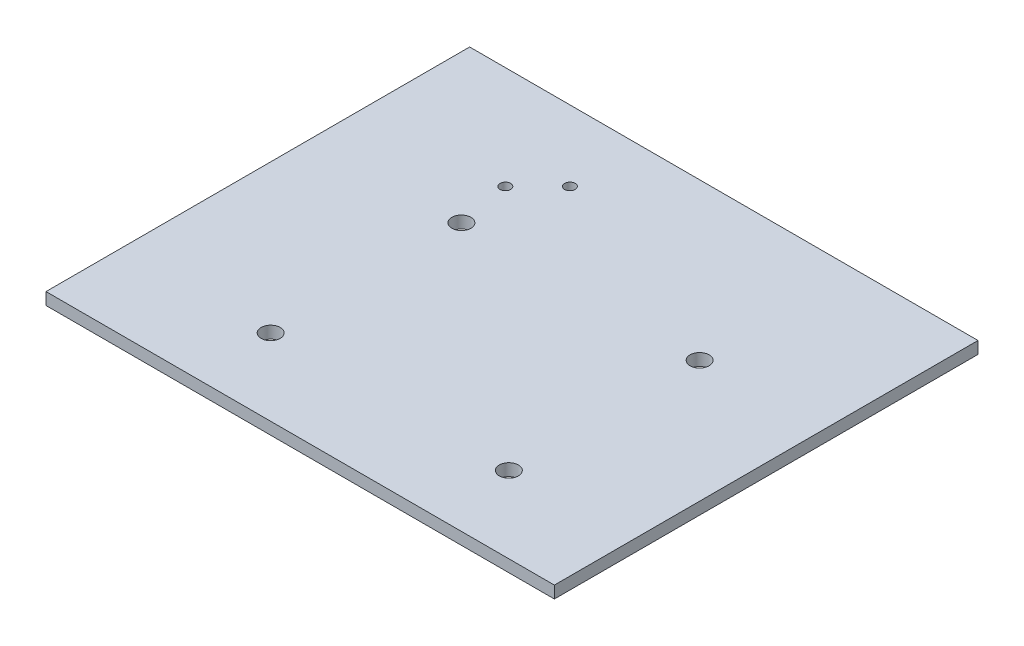
ISO-10303-21;
HEADER;
FILE_DESCRIPTION(('STEP AP214'),'2;1');
FILE_NAME('part.step','',(''),(''),'','','');
FILE_SCHEMA(('AUTOMOTIVE_DESIGN { 1 0 10303 214 1 1 1 1 }'));
ENDSEC;
DATA;
#1=APPLICATION_CONTEXT('core data for automotive mechanical design processes');
#2=APPLICATION_PROTOCOL_DEFINITION('international standard','automotive_design',2000,#1);
#3=PRODUCT_CONTEXT('',#1,'mechanical');
#4=PRODUCT('Part','Part','',(#3));
#5=PRODUCT_RELATED_PRODUCT_CATEGORY('part','',(#4));
#6=PRODUCT_DEFINITION_FORMATION('','',#4);
#7=PRODUCT_DEFINITION_CONTEXT('part definition',#1,'design');
#8=PRODUCT_DEFINITION('design','',#6,#7);
#9=PRODUCT_DEFINITION_SHAPE('','',#8);
#10=(LENGTH_UNIT() NAMED_UNIT(*) SI_UNIT(.MILLI.,.METRE.));
#11=(NAMED_UNIT(*) PLANE_ANGLE_UNIT() SI_UNIT($,.RADIAN.));
#12=(NAMED_UNIT(*) SI_UNIT($,.STERADIAN.) SOLID_ANGLE_UNIT());
#13=UNCERTAINTY_MEASURE_WITH_UNIT(LENGTH_MEASURE(1.E-05),#10,'distance_accuracy_value','');
#14=(GEOMETRIC_REPRESENTATION_CONTEXT(3) GLOBAL_UNCERTAINTY_ASSIGNED_CONTEXT((#13)) GLOBAL_UNIT_ASSIGNED_CONTEXT((#10,
#11,#12)) REPRESENTATION_CONTEXT('',''));
#15=CARTESIAN_POINT('',(0.,0.,0.));
#16=DIRECTION('',(0.,0.,1.));
#17=DIRECTION('',(1.,0.,0.));
#18=AXIS2_PLACEMENT_3D('',#15,#16,#17);
#19=CARTESIAN_POINT('',(-292.1,-0.00999999999999959,-222.25));
#20=DIRECTION('',(-1.,0.,0.));
#21=DIRECTION('',(0.,0.,1.));
#22=AXIS2_PLACEMENT_3D('',#19,#20,#21);
#23=PLANE('',#22);
#24=DIRECTION('',(0.,-1.,0.));
#25=VECTOR('',#24,1.);
#26=CARTESIAN_POINT('',(-292.1,6.35,-222.25));
#27=LINE('',#26,#25);
#28=CARTESIAN_POINT('',(-292.1,6.35,-222.25));
#29=VERTEX_POINT('',#28);
#30=CARTESIAN_POINT('',(-292.1,0.,-222.25));
#31=VERTEX_POINT('',#30);
#32=EDGE_CURVE('E128',#29,#31,#27,.T.);
#33=ORIENTED_EDGE('',*,*,#32,.F.);
#34=DIRECTION('',(0.,0.,1.));
#35=VECTOR('',#34,1.);
#36=CARTESIAN_POINT('',(-292.1,6.35,0.));
#37=LINE('',#36,#35);
#38=CARTESIAN_POINT('',(-292.1,6.35,0.));
#39=VERTEX_POINT('',#38);
#40=EDGE_CURVE('E11',#29,#39,#37,.T.);
#41=ORIENTED_EDGE('',*,*,#40,.T.);
#42=DIRECTION('',(0.,1.,0.));
#43=VECTOR('',#42,1.);
#44=CARTESIAN_POINT('',(-292.1,6.35,0.));
#45=LINE('',#44,#43);
#46=CARTESIAN_POINT('',(-292.1,0.,0.));
#47=VERTEX_POINT('',#46);
#48=EDGE_CURVE('E45',#47,#39,#45,.T.);
#49=ORIENTED_EDGE('',*,*,#48,.F.);
#50=DIRECTION('',(0.,0.,1.));
#51=VECTOR('',#50,1.);
#52=CARTESIAN_POINT('',(-292.1,0.,0.));
#53=LINE('',#52,#51);
#54=EDGE_CURVE('E107',#31,#47,#53,.T.);
#55=ORIENTED_EDGE('',*,*,#54,.F.);
#56=EDGE_LOOP('',(#33,#41,#49,#55));
#57=FACE_BOUND('',#56,.T.);
#58=ADVANCED_FACE('F42',(#57),#23,.F.);
#59=CARTESIAN_POINT('',(-558.8,6.35,-222.25));
#60=DIRECTION('',(1.,0.,0.));
#61=DIRECTION('',(0.,0.,-1.));
#62=AXIS2_PLACEMENT_3D('',#59,#60,#61);
#63=PLANE('',#62);
#64=DIRECTION('',(0.,0.,1.));
#65=VECTOR('',#64,1.);
#66=CARTESIAN_POINT('',(-558.8,0.,-222.25));
#67=LINE('',#66,#65);
#68=CARTESIAN_POINT('',(-558.8,0.,-222.25));
#69=VERTEX_POINT('',#68);
#70=CARTESIAN_POINT('',(-558.8,0.,0.));
#71=VERTEX_POINT('',#70);
#72=EDGE_CURVE('E125',#69,#71,#67,.T.);
#73=ORIENTED_EDGE('',*,*,#72,.T.);
#74=DIRECTION('',(0.,-1.,0.));
#75=VECTOR('',#74,1.);
#76=CARTESIAN_POINT('',(-558.8,6.35,0.));
#77=LINE('',#76,#75);
#78=CARTESIAN_POINT('',(-558.8,6.35,0.));
#79=VERTEX_POINT('',#78);
#80=EDGE_CURVE('E108',#79,#71,#77,.T.);
#81=ORIENTED_EDGE('',*,*,#80,.F.);
#82=DIRECTION('',(0.,0.,1.));
#83=VECTOR('',#82,1.);
#84=CARTESIAN_POINT('',(-558.8,6.35,-222.25));
#85=LINE('',#84,#83);
#86=CARTESIAN_POINT('',(-558.8,6.35,-222.25));
#87=VERTEX_POINT('',#86);
#88=EDGE_CURVE('E92',#87,#79,#85,.T.);
#89=ORIENTED_EDGE('',*,*,#88,.F.);
#90=DIRECTION('',(0.,-1.,0.));
#91=VECTOR('',#90,1.);
#92=CARTESIAN_POINT('',(-558.8,6.35,-222.25));
#93=LINE('',#92,#91);
#94=EDGE_CURVE('E100',#87,#69,#93,.T.);
#95=ORIENTED_EDGE('',*,*,#94,.T.);
#96=EDGE_LOOP('',(#73,#81,#89,#95));
#97=FACE_BOUND('',#96,.T.);
#98=ADVANCED_FACE('F110',(#97),#63,.F.);
#99=CARTESIAN_POINT('',(-558.8,6.35,0.));
#100=DIRECTION('',(0.,0.,-1.));
#101=DIRECTION('',(-1.,0.,0.));
#102=AXIS2_PLACEMENT_3D('',#99,#100,#101);
#103=PLANE('',#102);
#104=DIRECTION('',(1.,0.,0.));
#105=VECTOR('',#104,1.);
#106=CARTESIAN_POINT('',(-558.8,0.,0.));
#107=LINE('',#106,#105);
#108=EDGE_CURVE('E119',#71,#47,#107,.T.);
#109=ORIENTED_EDGE('',*,*,#108,.T.);
#110=ORIENTED_EDGE('',*,*,#48,.T.);
#111=DIRECTION('',(1.,0.,0.));
#112=VECTOR('',#111,1.);
#113=CARTESIAN_POINT('',(-558.8,6.35,0.));
#114=LINE('',#113,#112);
#115=EDGE_CURVE('E97',#79,#39,#114,.T.);
#116=ORIENTED_EDGE('',*,*,#115,.F.);
#117=ORIENTED_EDGE('',*,*,#80,.T.);
#118=EDGE_LOOP('',(#109,#110,#116,#117));
#119=FACE_BOUND('',#118,.T.);
#120=ADVANCED_FACE('F180',(#119),#103,.F.);
#121=CARTESIAN_POINT('',(-114.3,6.35,-222.25));
#122=DIRECTION('',(0.,0.,1.));
#123=DIRECTION('',(1.,0.,0.));
#124=AXIS2_PLACEMENT_3D('',#121,#122,#123);
#125=PLANE('',#124);
#126=DIRECTION('',(-1.,0.,0.));
#127=VECTOR('',#126,1.);
#128=CARTESIAN_POINT('',(-114.3,6.35,-222.25));
#129=LINE('',#128,#127);
#130=EDGE_CURVE('E87',#29,#87,#129,.T.);
#131=ORIENTED_EDGE('',*,*,#130,.F.);
#132=ORIENTED_EDGE('',*,*,#32,.T.);
#133=DIRECTION('',(-1.,0.,0.));
#134=VECTOR('',#133,1.);
#135=CARTESIAN_POINT('',(-114.3,0.,-222.25));
#136=LINE('',#135,#134);
#137=EDGE_CURVE('E103',#31,#69,#136,.T.);
#138=ORIENTED_EDGE('',*,*,#137,.T.);
#139=ORIENTED_EDGE('',*,*,#94,.F.);
#140=EDGE_LOOP('',(#131,#132,#138,#139));
#141=FACE_BOUND('',#140,.T.);
#142=ADVANCED_FACE('F101',(#141),#125,.F.);
#143=CARTESIAN_POINT('',(-481.076,0.,-40.132));
#144=DIRECTION('',(0.,1.,0.));
#145=DIRECTION('',(0.,0.,1.));
#146=AXIS2_PLACEMENT_3D('',#143,#144,#145);
#147=CYLINDRICAL_SURFACE('',#146,5.00000270000002);
#148=CARTESIAN_POINT('',(-481.076,6.35,-40.132));
#149=DIRECTION('',(0.,1.,0.));
#150=DIRECTION('',(0.,0.,1.));
#151=AXIS2_PLACEMENT_3D('',#148,#149,#150);
#152=CIRCLE('',#151,5.00000270000002);
#153=CARTESIAN_POINT('',(-481.076,6.35,-35.1319973));
#154=VERTEX_POINT('',#153);
#155=EDGE_CURVE('E138',#154,#154,#152,.T.);
#156=ORIENTED_EDGE('',*,*,#155,.T.);
#157=EDGE_LOOP('',(#156));
#158=FACE_BOUND('',#157,.T.);
#159=CARTESIAN_POINT('',(-481.076,0.,-40.132));
#160=DIRECTION('',(0.,1.,0.));
#161=DIRECTION('',(0.,0.,1.));
#162=AXIS2_PLACEMENT_3D('',#159,#160,#161);
#163=CIRCLE('',#162,5.00000270000002);
#164=CARTESIAN_POINT('',(-481.076,0.,-35.1319973));
#165=VERTEX_POINT('',#164);
#166=EDGE_CURVE('E135',#165,#165,#163,.T.);
#167=ORIENTED_EDGE('',*,*,#166,.F.);
#168=EDGE_LOOP('',(#167));
#169=FACE_BOUND('',#168,.T.);
#170=ADVANCED_FACE('F199',(#158,#169),#147,.F.);
#171=CARTESIAN_POINT('',(-356.108,0.,-40.132));
#172=DIRECTION('',(0.,1.,0.));
#173=DIRECTION('',(0.,0.,1.));
#174=AXIS2_PLACEMENT_3D('',#171,#172,#173);
#175=CYLINDRICAL_SURFACE('',#174,5.00000270000002);
#176=CARTESIAN_POINT('',(-356.108,6.35,-40.132));
#177=DIRECTION('',(0.,1.,0.));
#178=DIRECTION('',(0.,0.,1.));
#179=AXIS2_PLACEMENT_3D('',#176,#177,#178);
#180=CIRCLE('',#179,5.00000270000002);
#181=CARTESIAN_POINT('',(-356.108,6.35,-35.1319973));
#182=VERTEX_POINT('',#181);
#183=EDGE_CURVE('E141',#182,#182,#180,.T.);
#184=ORIENTED_EDGE('',*,*,#183,.T.);
#185=EDGE_LOOP('',(#184));
#186=FACE_BOUND('',#185,.T.);
#187=CARTESIAN_POINT('',(-356.108,0.,-40.132));
#188=DIRECTION('',(0.,1.,0.));
#189=DIRECTION('',(0.,0.,1.));
#190=AXIS2_PLACEMENT_3D('',#187,#188,#189);
#191=CIRCLE('',#190,5.00000270000002);
#192=CARTESIAN_POINT('',(-356.108,0.,-35.1319973));
#193=VERTEX_POINT('',#192);
#194=EDGE_CURVE('E132',#193,#193,#191,.T.);
#195=ORIENTED_EDGE('',*,*,#194,.F.);
#196=EDGE_LOOP('',(#195));
#197=FACE_BOUND('',#196,.T.);
#198=ADVANCED_FACE('F216',(#186,#197),#175,.F.);
#199=CARTESIAN_POINT('',(-356.108,0.,-140.208));
#200=DIRECTION('',(0.,1.,0.));
#201=DIRECTION('',(0.,0.,1.));
#202=AXIS2_PLACEMENT_3D('',#199,#200,#201);
#203=CYLINDRICAL_SURFACE('',#202,5.00000270000002);
#204=CARTESIAN_POINT('',(-356.108,6.35,-140.208));
#205=DIRECTION('',(0.,1.,0.));
#206=DIRECTION('',(0.,0.,1.));
#207=AXIS2_PLACEMENT_3D('',#204,#205,#206);
#208=CIRCLE('',#207,5.00000270000002);
#209=CARTESIAN_POINT('',(-356.108,6.35,-135.2079973));
#210=VERTEX_POINT('',#209);
#211=EDGE_CURVE('E159',#210,#210,#208,.T.);
#212=ORIENTED_EDGE('',*,*,#211,.T.);
#213=EDGE_LOOP('',(#212));
#214=FACE_BOUND('',#213,.T.);
#215=CARTESIAN_POINT('',(-356.108,0.,-140.208));
#216=DIRECTION('',(0.,1.,0.));
#217=DIRECTION('',(0.,0.,1.));
#218=AXIS2_PLACEMENT_3D('',#215,#216,#217);
#219=CIRCLE('',#218,5.00000270000002);
#220=CARTESIAN_POINT('',(-356.108,0.,-135.2079973));
#221=VERTEX_POINT('',#220);
#222=EDGE_CURVE('E136',#221,#221,#219,.T.);
#223=ORIENTED_EDGE('',*,*,#222,.F.);
#224=EDGE_LOOP('',(#223));
#225=FACE_BOUND('',#224,.T.);
#226=ADVANCED_FACE('F225',(#214,#225),#203,.F.);
#227=CARTESIAN_POINT('',(-481.076,0.,-140.208));
#228=DIRECTION('',(0.,1.,0.));
#229=DIRECTION('',(0.,0.,1.));
#230=AXIS2_PLACEMENT_3D('',#227,#228,#229);
#231=CYLINDRICAL_SURFACE('',#230,5.00000270000002);
#232=CARTESIAN_POINT('',(-481.076,6.35,-140.208));
#233=DIRECTION('',(0.,1.,0.));
#234=DIRECTION('',(0.,0.,1.));
#235=AXIS2_PLACEMENT_3D('',#232,#233,#234);
#236=CIRCLE('',#235,5.00000270000002);
#237=CARTESIAN_POINT('',(-481.076,6.35,-135.2079973));
#238=VERTEX_POINT('',#237);
#239=EDGE_CURVE('E122',#238,#238,#236,.T.);
#240=ORIENTED_EDGE('',*,*,#239,.T.);
#241=EDGE_LOOP('',(#240));
#242=FACE_BOUND('',#241,.T.);
#243=CARTESIAN_POINT('',(-481.076,0.,-140.208));
#244=DIRECTION('',(0.,1.,0.));
#245=DIRECTION('',(0.,0.,1.));
#246=AXIS2_PLACEMENT_3D('',#243,#244,#245);
#247=CIRCLE('',#246,5.00000270000002);
#248=CARTESIAN_POINT('',(-481.076,0.,-135.2079973));
#249=VERTEX_POINT('',#248);
#250=EDGE_CURVE('E149',#249,#249,#247,.T.);
#251=ORIENTED_EDGE('',*,*,#250,.F.);
#252=EDGE_LOOP('',(#251));
#253=FACE_BOUND('',#252,.T.);
#254=ADVANCED_FACE('F234',(#242,#253),#231,.F.);
#255=CARTESIAN_POINT('',(-469.142233333333,6.35,-185.187166666667));
#256=DIRECTION('',(0.,-1.,0.));
#257=DIRECTION('',(0.,0.,-1.));
#258=AXIS2_PLACEMENT_3D('',#255,#256,#257);
#259=CYLINDRICAL_SURFACE('',#258,2.77812500000002);
#260=CARTESIAN_POINT('',(-469.142233333333,6.35,-185.187166666667));
#261=DIRECTION('',(0.,-1.,0.));
#262=DIRECTION('',(0.,0.,-1.));
#263=AXIS2_PLACEMENT_3D('',#260,#261,#262);
#264=CIRCLE('',#263,2.77812500000002);
#265=CARTESIAN_POINT('',(-469.142233333333,6.35,-187.965291666667));
#266=VERTEX_POINT('',#265);
#267=EDGE_CURVE('E146',#266,#266,#264,.T.);
#268=ORIENTED_EDGE('',*,*,#267,.F.);
#269=EDGE_LOOP('',(#268));
#270=FACE_BOUND('',#269,.T.);
#271=CARTESIAN_POINT('',(-469.142233333333,0.,-185.187166666667));
#272=DIRECTION('',(0.,-1.,0.));
#273=DIRECTION('',(0.,0.,-1.));
#274=AXIS2_PLACEMENT_3D('',#271,#272,#273);
#275=CIRCLE('',#274,2.77812500000002);
#276=CARTESIAN_POINT('',(-469.142233333333,0.,-187.965291666667));
#277=VERTEX_POINT('',#276);
#278=EDGE_CURVE('E150',#277,#277,#275,.T.);
#279=ORIENTED_EDGE('',*,*,#278,.T.);
#280=EDGE_LOOP('',(#279));
#281=FACE_BOUND('',#280,.T.);
#282=ADVANCED_FACE('F243',(#270,#281),#259,.F.);
#283=CARTESIAN_POINT('',(-486.075566666667,6.35,-168.253833333333));
#284=DIRECTION('',(0.,-1.,0.));
#285=DIRECTION('',(0.,0.,-1.));
#286=AXIS2_PLACEMENT_3D('',#283,#284,#285);
#287=CYLINDRICAL_SURFACE('',#286,2.77812500000002);
#288=CARTESIAN_POINT('',(-486.075566666667,6.35,-168.253833333333));
#289=DIRECTION('',(0.,-1.,0.));
#290=DIRECTION('',(0.,0.,-1.));
#291=AXIS2_PLACEMENT_3D('',#288,#289,#290);
#292=CIRCLE('',#291,2.77812500000002);
#293=CARTESIAN_POINT('',(-486.075566666667,6.35,-171.031958333333));
#294=VERTEX_POINT('',#293);
#295=EDGE_CURVE('E152',#294,#294,#292,.T.);
#296=ORIENTED_EDGE('',*,*,#295,.F.);
#297=EDGE_LOOP('',(#296));
#298=FACE_BOUND('',#297,.T.);
#299=CARTESIAN_POINT('',(-486.075566666667,0.,-168.253833333333));
#300=DIRECTION('',(0.,-1.,0.));
#301=DIRECTION('',(0.,0.,-1.));
#302=AXIS2_PLACEMENT_3D('',#299,#300,#301);
#303=CIRCLE('',#302,2.77812500000002);
#304=CARTESIAN_POINT('',(-486.075566666667,0.,-171.031958333333));
#305=VERTEX_POINT('',#304);
#306=EDGE_CURVE('E155',#305,#305,#303,.T.);
#307=ORIENTED_EDGE('',*,*,#306,.T.);
#308=EDGE_LOOP('',(#307));
#309=FACE_BOUND('',#308,.T.);
#310=ADVANCED_FACE('F195',(#298,#309),#287,.F.);
#311=CARTESIAN_POINT('',(0.,0.,0.));
#312=DIRECTION('',(0.,1.,0.));
#313=DIRECTION('',(0.,0.,1.));
#314=AXIS2_PLACEMENT_3D('',#311,#312,#313);
#315=PLANE('',#314);
#316=ORIENTED_EDGE('',*,*,#306,.F.);
#317=EDGE_LOOP('',(#316));
#318=FACE_BOUND('',#317,.T.);
#319=ORIENTED_EDGE('',*,*,#278,.F.);
#320=EDGE_LOOP('',(#319));
#321=FACE_BOUND('',#320,.T.);
#322=ORIENTED_EDGE('',*,*,#250,.T.);
#323=EDGE_LOOP('',(#322));
#324=FACE_BOUND('',#323,.T.);
#325=ORIENTED_EDGE('',*,*,#222,.T.);
#326=EDGE_LOOP('',(#325));
#327=FACE_BOUND('',#326,.T.);
#328=ORIENTED_EDGE('',*,*,#194,.T.);
#329=EDGE_LOOP('',(#328));
#330=FACE_BOUND('',#329,.T.);
#331=ORIENTED_EDGE('',*,*,#166,.T.);
#332=EDGE_LOOP('',(#331));
#333=FACE_BOUND('',#332,.T.);
#334=ORIENTED_EDGE('',*,*,#137,.F.);
#335=ORIENTED_EDGE('',*,*,#54,.T.);
#336=ORIENTED_EDGE('',*,*,#108,.F.);
#337=ORIENTED_EDGE('',*,*,#72,.F.);
#338=EDGE_LOOP('',(#334,#335,#336,#337));
#339=FACE_BOUND('',#338,.T.);
#340=ADVANCED_FACE('F183',(#318,#321,#324,#327,#330,#333,#339),#315,.F.);
#341=CARTESIAN_POINT('',(0.,6.35,0.));
#342=DIRECTION('',(0.,1.,0.));
#343=DIRECTION('',(0.,0.,1.));
#344=AXIS2_PLACEMENT_3D('',#341,#342,#343);
#345=PLANE('',#344);
#346=ORIENTED_EDGE('',*,*,#40,.F.);
#347=ORIENTED_EDGE('',*,*,#130,.T.);
#348=ORIENTED_EDGE('',*,*,#88,.T.);
#349=ORIENTED_EDGE('',*,*,#115,.T.);
#350=EDGE_LOOP('',(#346,#347,#348,#349));
#351=FACE_BOUND('',#350,.T.);
#352=ORIENTED_EDGE('',*,*,#295,.T.);
#353=EDGE_LOOP('',(#352));
#354=FACE_BOUND('',#353,.T.);
#355=ORIENTED_EDGE('',*,*,#267,.T.);
#356=EDGE_LOOP('',(#355));
#357=FACE_BOUND('',#356,.T.);
#358=ORIENTED_EDGE('',*,*,#239,.F.);
#359=EDGE_LOOP('',(#358));
#360=FACE_BOUND('',#359,.T.);
#361=ORIENTED_EDGE('',*,*,#211,.F.);
#362=EDGE_LOOP('',(#361));
#363=FACE_BOUND('',#362,.T.);
#364=ORIENTED_EDGE('',*,*,#183,.F.);
#365=EDGE_LOOP('',(#364));
#366=FACE_BOUND('',#365,.T.);
#367=ORIENTED_EDGE('',*,*,#155,.F.);
#368=EDGE_LOOP('',(#367));
#369=FACE_BOUND('',#368,.T.);
#370=ADVANCED_FACE('F89',(#351,#354,#357,#360,#363,#366,#369),#345,.T.);
#371=CLOSED_SHELL('',(#58,#98,#120,#142,#170,#198,#226,#254,#282,#310,#340,#370));
#372=MANIFOLD_SOLID_BREP('B2',#371);
#373=ADVANCED_BREP_SHAPE_REPRESENTATION('',(#18,#372),#14);
#374=SHAPE_DEFINITION_REPRESENTATION(#9,#373);
ENDSEC;
END-ISO-10303-21;
